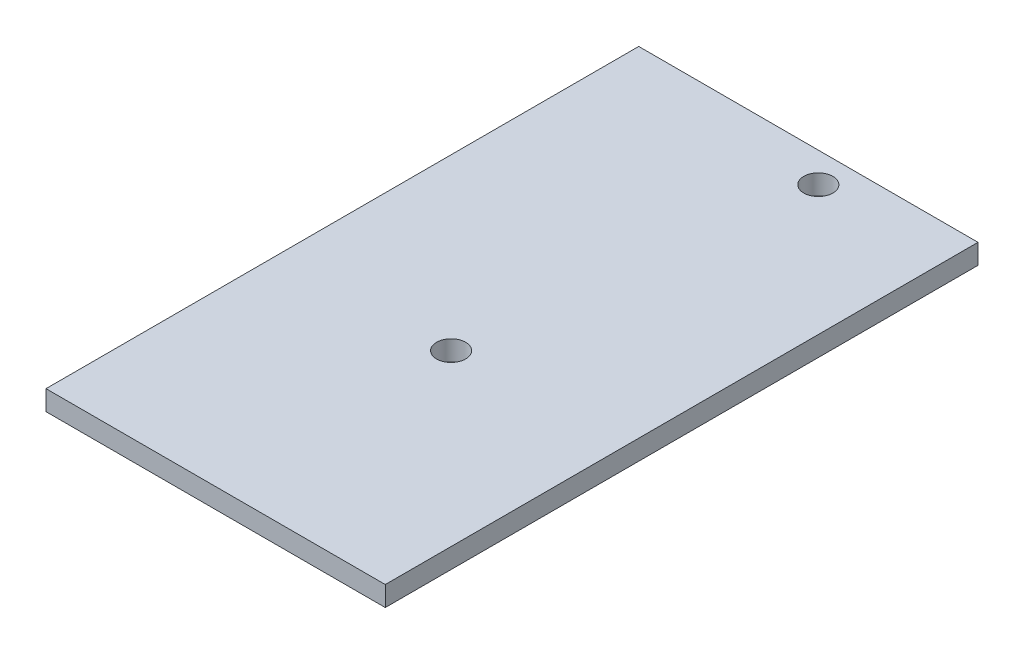
ISO-10303-21;
HEADER;
FILE_DESCRIPTION(('STEP AP214'),'2;1');
FILE_NAME('part.step','',(''),(''),'','','');
FILE_SCHEMA(('AUTOMOTIVE_DESIGN { 1 0 10303 214 1 1 1 1 }'));
ENDSEC;
DATA;
#1=APPLICATION_CONTEXT('core data for automotive mechanical design processes');
#2=APPLICATION_PROTOCOL_DEFINITION('international standard','automotive_design',2000,#1);
#3=PRODUCT_CONTEXT('',#1,'mechanical');
#4=PRODUCT('Part','Part','',(#3));
#5=PRODUCT_RELATED_PRODUCT_CATEGORY('part','',(#4));
#6=PRODUCT_DEFINITION_FORMATION('','',#4);
#7=PRODUCT_DEFINITION_CONTEXT('part definition',#1,'design');
#8=PRODUCT_DEFINITION('design','',#6,#7);
#9=PRODUCT_DEFINITION_SHAPE('','',#8);
#10=(LENGTH_UNIT() NAMED_UNIT(*) SI_UNIT(.MILLI.,.METRE.));
#11=(NAMED_UNIT(*) PLANE_ANGLE_UNIT() SI_UNIT($,.RADIAN.));
#12=(NAMED_UNIT(*) SI_UNIT($,.STERADIAN.) SOLID_ANGLE_UNIT());
#13=UNCERTAINTY_MEASURE_WITH_UNIT(LENGTH_MEASURE(1.E-05),#10,'distance_accuracy_value','');
#14=(GEOMETRIC_REPRESENTATION_CONTEXT(3) GLOBAL_UNCERTAINTY_ASSIGNED_CONTEXT((#13)) GLOBAL_UNIT_ASSIGNED_CONTEXT((#10,
#11,#12)) REPRESENTATION_CONTEXT('',''));
#15=CARTESIAN_POINT('',(0.,0.,0.));
#16=DIRECTION('',(0.,0.,1.));
#17=DIRECTION('',(1.,0.,0.));
#18=AXIS2_PLACEMENT_3D('',#15,#16,#17);
#19=CARTESIAN_POINT('',(-26.67,2.54,-43.18));
#20=DIRECTION('',(1.,0.,0.));
#21=DIRECTION('',(0.,0.,-1.));
#22=AXIS2_PLACEMENT_3D('',#19,#20,#21);
#23=PLANE('',#22);
#24=DIRECTION('',(0.,0.,1.));
#25=VECTOR('',#24,1.);
#26=CARTESIAN_POINT('',(-26.67,0.,-43.18));
#27=LINE('',#26,#25);
#28=CARTESIAN_POINT('',(-26.67,0.,-43.18));
#29=VERTEX_POINT('',#28);
#30=CARTESIAN_POINT('',(-26.67,0.,32.258));
#31=VERTEX_POINT('',#30);
#32=EDGE_CURVE('E100',#29,#31,#27,.T.);
#33=ORIENTED_EDGE('',*,*,#32,.T.);
#34=DIRECTION('',(0.,-1.,0.));
#35=VECTOR('',#34,1.);
#36=CARTESIAN_POINT('',(-26.67,2.54,32.258));
#37=LINE('',#36,#35);
#38=CARTESIAN_POINT('',(-26.67,2.54,32.258));
#39=VERTEX_POINT('',#38);
#40=EDGE_CURVE('E11',#39,#31,#37,.T.);
#41=ORIENTED_EDGE('',*,*,#40,.F.);
#42=DIRECTION('',(0.,0.,1.));
#43=VECTOR('',#42,1.);
#44=CARTESIAN_POINT('',(-26.67,2.54,-43.18));
#45=LINE('',#44,#43);
#46=CARTESIAN_POINT('',(-26.67,2.54,-43.18));
#47=VERTEX_POINT('',#46);
#48=EDGE_CURVE('E88',#47,#39,#45,.T.);
#49=ORIENTED_EDGE('',*,*,#48,.F.);
#50=DIRECTION('',(0.,-1.,0.));
#51=VECTOR('',#50,1.);
#52=CARTESIAN_POINT('',(-26.67,2.54,-43.18));
#53=LINE('',#52,#51);
#54=EDGE_CURVE('E96',#47,#29,#53,.T.);
#55=ORIENTED_EDGE('',*,*,#54,.T.);
#56=EDGE_LOOP('',(#33,#41,#49,#55));
#57=FACE_BOUND('',#56,.T.);
#58=ADVANCED_FACE('F37',(#57),#23,.F.);
#59=CARTESIAN_POINT('',(-26.67,2.54,32.258));
#60=DIRECTION('',(0.,0.,-1.));
#61=DIRECTION('',(-1.,0.,0.));
#62=AXIS2_PLACEMENT_3D('',#59,#60,#61);
#63=PLANE('',#62);
#64=DIRECTION('',(1.,0.,0.));
#65=VECTOR('',#64,1.);
#66=CARTESIAN_POINT('',(-26.67,0.,32.258));
#67=LINE('',#66,#65);
#68=CARTESIAN_POINT('',(16.51,0.,32.258));
#69=VERTEX_POINT('',#68);
#70=EDGE_CURVE('E92',#31,#69,#67,.T.);
#71=ORIENTED_EDGE('',*,*,#70,.T.);
#72=DIRECTION('',(0.,-1.,0.));
#73=VECTOR('',#72,1.);
#74=CARTESIAN_POINT('',(16.51,2.54,32.258));
#75=LINE('',#74,#73);
#76=CARTESIAN_POINT('',(16.51,2.54,32.258));
#77=VERTEX_POINT('',#76);
#78=EDGE_CURVE('E45',#77,#69,#75,.T.);
#79=ORIENTED_EDGE('',*,*,#78,.F.);
#80=DIRECTION('',(1.,0.,0.));
#81=VECTOR('',#80,1.);
#82=CARTESIAN_POINT('',(-26.67,2.54,32.258));
#83=LINE('',#82,#81);
#84=EDGE_CURVE('E83',#39,#77,#83,.T.);
#85=ORIENTED_EDGE('',*,*,#84,.F.);
#86=ORIENTED_EDGE('',*,*,#40,.T.);
#87=EDGE_LOOP('',(#71,#79,#85,#86));
#88=FACE_BOUND('',#87,.T.);
#89=ADVANCED_FACE('F91',(#88),#63,.F.);
#90=CARTESIAN_POINT('',(16.51,2.54,-43.18));
#91=DIRECTION('',(-1.,0.,0.));
#92=DIRECTION('',(0.,0.,1.));
#93=AXIS2_PLACEMENT_3D('',#90,#91,#92);
#94=PLANE('',#93);
#95=DIRECTION('',(0.,0.,-1.));
#96=VECTOR('',#95,1.);
#97=CARTESIAN_POINT('',(16.51,0.,-43.18));
#98=LINE('',#97,#96);
#99=CARTESIAN_POINT('',(16.51,0.,-43.18));
#100=VERTEX_POINT('',#99);
#101=EDGE_CURVE('E70',#69,#100,#98,.T.);
#102=ORIENTED_EDGE('',*,*,#101,.T.);
#103=DIRECTION('',(0.,-1.,0.));
#104=VECTOR('',#103,1.);
#105=CARTESIAN_POINT('',(16.51,2.54,-43.18));
#106=LINE('',#105,#104);
#107=CARTESIAN_POINT('',(16.51,2.54,-43.18));
#108=VERTEX_POINT('',#107);
#109=EDGE_CURVE('E93',#108,#100,#106,.T.);
#110=ORIENTED_EDGE('',*,*,#109,.F.);
#111=DIRECTION('',(0.,0.,-1.));
#112=VECTOR('',#111,1.);
#113=CARTESIAN_POINT('',(16.51,2.54,-43.18));
#114=LINE('',#113,#112);
#115=EDGE_CURVE('E86',#77,#108,#114,.T.);
#116=ORIENTED_EDGE('',*,*,#115,.F.);
#117=ORIENTED_EDGE('',*,*,#78,.T.);
#118=EDGE_LOOP('',(#102,#110,#116,#117));
#119=FACE_BOUND('',#118,.T.);
#120=ADVANCED_FACE('F94',(#119),#94,.F.);
#121=CARTESIAN_POINT('',(-26.67,2.54,-43.18));
#122=DIRECTION('',(0.,0.,1.));
#123=DIRECTION('',(1.,0.,0.));
#124=AXIS2_PLACEMENT_3D('',#121,#122,#123);
#125=PLANE('',#124);
#126=DIRECTION('',(-1.,0.,0.));
#127=VECTOR('',#126,1.);
#128=CARTESIAN_POINT('',(-26.67,0.,-43.18));
#129=LINE('',#128,#127);
#130=EDGE_CURVE('E76',#100,#29,#129,.T.);
#131=ORIENTED_EDGE('',*,*,#130,.T.);
#132=ORIENTED_EDGE('',*,*,#54,.F.);
#133=DIRECTION('',(-1.,0.,0.));
#134=VECTOR('',#133,1.);
#135=CARTESIAN_POINT('',(-26.67,2.54,-43.18));
#136=LINE('',#135,#134);
#137=EDGE_CURVE('E53',#108,#47,#136,.T.);
#138=ORIENTED_EDGE('',*,*,#137,.F.);
#139=ORIENTED_EDGE('',*,*,#109,.T.);
#140=EDGE_LOOP('',(#131,#132,#138,#139));
#141=FACE_BOUND('',#140,.T.);
#142=ADVANCED_FACE('F108',(#141),#125,.F.);
#143=CARTESIAN_POINT('',(0.,2.54,0.));
#144=DIRECTION('',(0.,1.,0.));
#145=DIRECTION('',(0.,0.,1.));
#146=AXIS2_PLACEMENT_3D('',#143,#144,#145);
#147=PLANE('',#146);
#148=CARTESIAN_POINT('',(0.,2.54,-39.37));
#149=DIRECTION('',(0.,1.,0.));
#150=DIRECTION('',(0.,0.,1.));
#151=AXIS2_PLACEMENT_3D('',#148,#149,#150);
#152=CIRCLE('',#151,1.85);
#153=CARTESIAN_POINT('',(0.,2.54,-37.52));
#154=VERTEX_POINT('',#153);
#155=EDGE_CURVE('E122',#154,#154,#152,.T.);
#156=ORIENTED_EDGE('',*,*,#155,.F.);
#157=EDGE_LOOP('',(#156));
#158=FACE_BOUND('',#157,.T.);
#159=CARTESIAN_POINT('',(-5.07999999999999,2.54,2.286));
#160=DIRECTION('',(0.,1.,0.));
#161=DIRECTION('',(0.,0.,1.));
#162=AXIS2_PLACEMENT_3D('',#159,#160,#161);
#163=CIRCLE('',#162,1.85);
#164=CARTESIAN_POINT('',(-5.07999999999999,2.54,4.136));
#165=VERTEX_POINT('',#164);
#166=EDGE_CURVE('E116',#165,#165,#163,.T.);
#167=ORIENTED_EDGE('',*,*,#166,.F.);
#168=EDGE_LOOP('',(#167));
#169=FACE_BOUND('',#168,.T.);
#170=ORIENTED_EDGE('',*,*,#48,.T.);
#171=ORIENTED_EDGE('',*,*,#84,.T.);
#172=ORIENTED_EDGE('',*,*,#115,.T.);
#173=ORIENTED_EDGE('',*,*,#137,.T.);
#174=EDGE_LOOP('',(#170,#171,#172,#173));
#175=FACE_BOUND('',#174,.T.);
#176=ADVANCED_FACE('F84',(#158,#169,#175),#147,.T.);
#177=CARTESIAN_POINT('',(0.,0.,0.));
#178=DIRECTION('',(0.,1.,0.));
#179=DIRECTION('',(0.,0.,1.));
#180=AXIS2_PLACEMENT_3D('',#177,#178,#179);
#181=PLANE('',#180);
#182=CARTESIAN_POINT('',(0.,0.,-39.37));
#183=DIRECTION('',(0.,1.,0.));
#184=DIRECTION('',(0.,0.,1.));
#185=AXIS2_PLACEMENT_3D('',#182,#183,#184);
#186=CIRCLE('',#185,1.85);
#187=CARTESIAN_POINT('',(0.,0.,-37.52));
#188=VERTEX_POINT('',#187);
#189=EDGE_CURVE('E119',#188,#188,#186,.T.);
#190=ORIENTED_EDGE('',*,*,#189,.T.);
#191=EDGE_LOOP('',(#190));
#192=FACE_BOUND('',#191,.T.);
#193=CARTESIAN_POINT('',(-5.07999999999999,0.,2.286));
#194=DIRECTION('',(0.,1.,0.));
#195=DIRECTION('',(0.,0.,1.));
#196=AXIS2_PLACEMENT_3D('',#193,#194,#195);
#197=CIRCLE('',#196,1.85);
#198=CARTESIAN_POINT('',(-5.07999999999999,0.,4.136));
#199=VERTEX_POINT('',#198);
#200=EDGE_CURVE('E103',#199,#199,#197,.T.);
#201=ORIENTED_EDGE('',*,*,#200,.T.);
#202=EDGE_LOOP('',(#201));
#203=FACE_BOUND('',#202,.T.);
#204=ORIENTED_EDGE('',*,*,#32,.F.);
#205=ORIENTED_EDGE('',*,*,#130,.F.);
#206=ORIENTED_EDGE('',*,*,#101,.F.);
#207=ORIENTED_EDGE('',*,*,#70,.F.);
#208=EDGE_LOOP('',(#204,#205,#206,#207));
#209=FACE_BOUND('',#208,.T.);
#210=ADVANCED_FACE('F111',(#192,#203,#209),#181,.F.);
#211=CARTESIAN_POINT('',(-5.07999999999999,2.54,2.286));
#212=DIRECTION('',(0.,1.,0.));
#213=DIRECTION('',(0.,0.,1.));
#214=AXIS2_PLACEMENT_3D('',#211,#212,#213);
#215=CYLINDRICAL_SURFACE('',#214,1.85);
#216=ORIENTED_EDGE('',*,*,#166,.T.);
#217=EDGE_LOOP('',(#216));
#218=FACE_BOUND('',#217,.T.);
#219=ORIENTED_EDGE('',*,*,#200,.F.);
#220=EDGE_LOOP('',(#219));
#221=FACE_BOUND('',#220,.T.);
#222=ADVANCED_FACE('F134',(#218,#221),#215,.F.);
#223=CARTESIAN_POINT('',(0.,2.54,-39.37));
#224=DIRECTION('',(0.,1.,0.));
#225=DIRECTION('',(0.,0.,1.));
#226=AXIS2_PLACEMENT_3D('',#223,#224,#225);
#227=CYLINDRICAL_SURFACE('',#226,1.85);
#228=ORIENTED_EDGE('',*,*,#155,.T.);
#229=EDGE_LOOP('',(#228));
#230=FACE_BOUND('',#229,.T.);
#231=ORIENTED_EDGE('',*,*,#189,.F.);
#232=EDGE_LOOP('',(#231));
#233=FACE_BOUND('',#232,.T.);
#234=ADVANCED_FACE('F126',(#230,#233),#227,.F.);
#235=CLOSED_SHELL('',(#58,#89,#120,#142,#176,#210,#222,#234));
#236=MANIFOLD_SOLID_BREP('B2',#235);
#237=ADVANCED_BREP_SHAPE_REPRESENTATION('',(#18,#236),#14);
#238=SHAPE_DEFINITION_REPRESENTATION(#9,#237);
ENDSEC;
END-ISO-10303-21;
